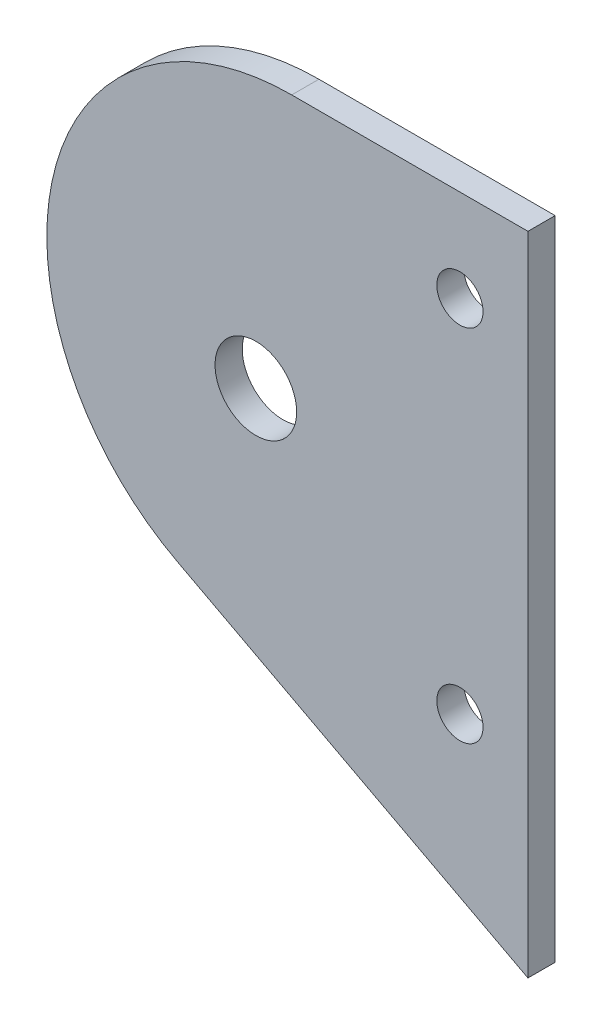
ISO-10303-21;
HEADER;
FILE_DESCRIPTION(('STEP AP214'),'2;1');
FILE_NAME('part.step','',(''),(''),'','','');
FILE_SCHEMA(('AUTOMOTIVE_DESIGN { 1 0 10303 214 1 1 1 1 }'));
ENDSEC;
DATA;
#1=APPLICATION_CONTEXT('core data for automotive mechanical design processes');
#2=APPLICATION_PROTOCOL_DEFINITION('international standard','automotive_design',2000,#1);
#3=PRODUCT_CONTEXT('',#1,'mechanical');
#4=PRODUCT('Part','Part','',(#3));
#5=PRODUCT_RELATED_PRODUCT_CATEGORY('part','',(#4));
#6=PRODUCT_DEFINITION_FORMATION('','',#4);
#7=PRODUCT_DEFINITION_CONTEXT('part definition',#1,'design');
#8=PRODUCT_DEFINITION('design','',#6,#7);
#9=PRODUCT_DEFINITION_SHAPE('','',#8);
#10=(LENGTH_UNIT() NAMED_UNIT(*) SI_UNIT(.MILLI.,.METRE.));
#11=(NAMED_UNIT(*) PLANE_ANGLE_UNIT() SI_UNIT($,.RADIAN.));
#12=(NAMED_UNIT(*) SI_UNIT($,.STERADIAN.) SOLID_ANGLE_UNIT());
#13=UNCERTAINTY_MEASURE_WITH_UNIT(LENGTH_MEASURE(1.E-05),#10,'distance_accuracy_value','');
#14=(GEOMETRIC_REPRESENTATION_CONTEXT(3) GLOBAL_UNCERTAINTY_ASSIGNED_CONTEXT((#13)) GLOBAL_UNIT_ASSIGNED_CONTEXT((#10,
#11,#12)) REPRESENTATION_CONTEXT('',''));
#15=CARTESIAN_POINT('',(0.,0.,0.));
#16=DIRECTION('',(0.,0.,1.));
#17=DIRECTION('',(1.,0.,0.));
#18=AXIS2_PLACEMENT_3D('',#15,#16,#17);
#19=CARTESIAN_POINT('',(0.,0.,2.));
#20=DIRECTION('',(0.,0.,-1.));
#21=DIRECTION('',(-1.,0.,0.));
#22=AXIS2_PLACEMENT_3D('',#19,#20,#21);
#23=PLANE('',#22);
#24=CARTESIAN_POINT('',(-160.,33.228756555323,2.));
#25=DIRECTION('',(0.,0.,-1.));
#26=DIRECTION('',(-1.,0.,0.));
#27=AXIS2_PLACEMENT_3D('',#24,#25,#26);
#28=CIRCLE('',#27,1.70000000000001);
#29=CARTESIAN_POINT('',(-161.7,33.228756555323,2.));
#30=VERTEX_POINT('',#29);
#31=EDGE_CURVE('E195',#30,#30,#28,.T.);
#32=ORIENTED_EDGE('',*,*,#31,.T.);
#33=EDGE_LOOP('',(#32));
#34=FACE_BOUND('',#33,.T.);
#35=CARTESIAN_POINT('',(-160.,6.771243444677,2.));
#36=DIRECTION('',(0.,0.,-1.));
#37=DIRECTION('',(-1.,0.,0.));
#38=AXIS2_PLACEMENT_3D('',#35,#36,#37);
#39=CIRCLE('',#38,1.70000000000001);
#40=CARTESIAN_POINT('',(-161.7,6.771243444677,2.));
#41=VERTEX_POINT('',#40);
#42=EDGE_CURVE('E83',#41,#41,#39,.T.);
#43=ORIENTED_EDGE('',*,*,#42,.T.);
#44=EDGE_LOOP('',(#43));
#45=FACE_BOUND('',#44,.T.);
#46=CARTESIAN_POINT('',(-175.,20.,2.));
#47=DIRECTION('',(0.,0.,1.));
#48=DIRECTION('',(1.,0.,0.));
#49=AXIS2_PLACEMENT_3D('',#46,#47,#48);
#50=CIRCLE('',#49,2.99999999999999);
#51=CARTESIAN_POINT('',(-172.,20.,2.));
#52=VERTEX_POINT('',#51);
#53=EDGE_CURVE('E98',#52,#52,#50,.T.);
#54=ORIENTED_EDGE('',*,*,#53,.F.);
#55=EDGE_LOOP('',(#54));
#56=FACE_BOUND('',#55,.T.);
#57=DIRECTION('',(0.,-1.,0.));
#58=VECTOR('',#57,1.);
#59=CARTESIAN_POINT('',(-155.,61.1481671859586,2.));
#60=LINE('',#59,#58);
#61=CARTESIAN_POINT('',(-155.,40.,2.));
#62=VERTEX_POINT('',#61);
#63=CARTESIAN_POINT('',(-155.,-7.53286063721654,2.));
#64=VERTEX_POINT('',#63);
#65=EDGE_CURVE('E75',#62,#64,#60,.T.);
#66=ORIENTED_EDGE('',*,*,#65,.F.);
#67=DIRECTION('',(-1.,0.,0.));
#68=VECTOR('',#67,1.);
#69=CARTESIAN_POINT('',(110.,40.,2.));
#70=LINE('',#69,#68);
#71=CARTESIAN_POINT('',(-172.363587037174,40.,2.));
#72=VERTEX_POINT('',#71);
#73=EDGE_CURVE('E80',#62,#72,#70,.T.);
#74=ORIENTED_EDGE('',*,*,#73,.T.);
#75=CARTESIAN_POINT('',(-172.363587037174,22.,2.));
#76=DIRECTION('',(0.,0.,-1.));
#77=DIRECTION('',(-1.,0.,0.));
#78=AXIS2_PLACEMENT_3D('',#75,#76,#77);
#79=CIRCLE('',#78,18.);
#80=CARTESIAN_POINT('',(-180.772782979186,6.08505659423045,2.));
#81=VERTEX_POINT('',#80);
#82=EDGE_CURVE('E57',#72,#81,#79,.F.);
#83=ORIENTED_EDGE('',*,*,#82,.T.);
#84=DIRECTION('',(0.884163522542753,-0.467177552334003,0.));
#85=VECTOR('',#84,1.);
#86=CARTESIAN_POINT('',(-244.958991581617,40.,2.));
#87=LINE('',#86,#85);
#88=EDGE_CURVE('E82',#81,#64,#87,.T.);
#89=ORIENTED_EDGE('',*,*,#88,.T.);
#90=EDGE_LOOP('',(#66,#74,#83,#89));
#91=FACE_BOUND('',#90,.T.);
#92=ADVANCED_FACE('F35',(#34,#45,#56,#91),#23,.F.);
#93=CARTESIAN_POINT('',(0.,0.,0.));
#94=DIRECTION('',(0.,0.,-1.));
#95=DIRECTION('',(-1.,0.,0.));
#96=AXIS2_PLACEMENT_3D('',#93,#94,#95);
#97=PLANE('',#96);
#98=CARTESIAN_POINT('',(-160.,33.228756555323,0.));
#99=DIRECTION('',(0.,0.,-1.));
#100=DIRECTION('',(-1.,0.,0.));
#101=AXIS2_PLACEMENT_3D('',#98,#99,#100);
#102=CIRCLE('',#101,1.69999999999998);
#103=CARTESIAN_POINT('',(-161.7,33.228756555323,0.));
#104=VERTEX_POINT('',#103);
#105=EDGE_CURVE('E198',#104,#104,#102,.T.);
#106=ORIENTED_EDGE('',*,*,#105,.F.);
#107=EDGE_LOOP('',(#106));
#108=FACE_BOUND('',#107,.T.);
#109=CARTESIAN_POINT('',(-160.,6.771243444677,0.));
#110=DIRECTION('',(0.,0.,-1.));
#111=DIRECTION('',(-1.,0.,0.));
#112=AXIS2_PLACEMENT_3D('',#109,#110,#111);
#113=CIRCLE('',#112,1.69999999999998);
#114=CARTESIAN_POINT('',(-161.7,6.771243444677,0.));
#115=VERTEX_POINT('',#114);
#116=EDGE_CURVE('E200',#115,#115,#113,.T.);
#117=ORIENTED_EDGE('',*,*,#116,.F.);
#118=EDGE_LOOP('',(#117));
#119=FACE_BOUND('',#118,.T.);
#120=CARTESIAN_POINT('',(-175.,20.,0.));
#121=DIRECTION('',(0.,0.,1.));
#122=DIRECTION('',(1.,0.,0.));
#123=AXIS2_PLACEMENT_3D('',#120,#121,#122);
#124=CIRCLE('',#123,2.99999999999999);
#125=CARTESIAN_POINT('',(-172.,20.,0.));
#126=VERTEX_POINT('',#125);
#127=EDGE_CURVE('E112',#126,#126,#124,.T.);
#128=ORIENTED_EDGE('',*,*,#127,.T.);
#129=EDGE_LOOP('',(#128));
#130=FACE_BOUND('',#129,.T.);
#131=DIRECTION('',(-1.,0.,0.));
#132=VECTOR('',#131,1.);
#133=CARTESIAN_POINT('',(-244.958991581617,40.,0.));
#134=LINE('',#133,#132);
#135=CARTESIAN_POINT('',(-155.,40.,0.));
#136=VERTEX_POINT('',#135);
#137=CARTESIAN_POINT('',(-172.363587037174,40.,0.));
#138=VERTEX_POINT('',#137);
#139=EDGE_CURVE('E91',#136,#138,#134,.T.);
#140=ORIENTED_EDGE('',*,*,#139,.F.);
#141=DIRECTION('',(0.,-1.,0.));
#142=VECTOR('',#141,1.);
#143=CARTESIAN_POINT('',(-155.,0.,0.));
#144=LINE('',#143,#142);
#145=CARTESIAN_POINT('',(-155.,-7.53286063721655,0.));
#146=VERTEX_POINT('',#145);
#147=EDGE_CURVE('E49',#136,#146,#144,.T.);
#148=ORIENTED_EDGE('',*,*,#147,.T.);
#149=DIRECTION('',(0.884163522542753,-0.467177552334003,0.));
#150=VECTOR('',#149,1.);
#151=CARTESIAN_POINT('',(-244.958991581617,40.,0.));
#152=LINE('',#151,#150);
#153=CARTESIAN_POINT('',(-180.772782979186,6.08505659423045,0.));
#154=VERTEX_POINT('',#153);
#155=EDGE_CURVE('E95',#154,#146,#152,.T.);
#156=ORIENTED_EDGE('',*,*,#155,.F.);
#157=CARTESIAN_POINT('',(-172.363587037174,22.,0.));
#158=DIRECTION('',(0.,0.,-1.));
#159=DIRECTION('',(-1.,0.,0.));
#160=AXIS2_PLACEMENT_3D('',#157,#158,#159);
#161=CIRCLE('',#160,18.);
#162=EDGE_CURVE('E89',#154,#138,#161,.T.);
#163=ORIENTED_EDGE('',*,*,#162,.T.);
#164=EDGE_LOOP('',(#140,#148,#156,#163));
#165=FACE_BOUND('',#164,.T.);
#166=ADVANCED_FACE('F109',(#108,#119,#130,#165),#97,.T.);
#167=CARTESIAN_POINT('',(-244.958991581617,40.,2.));
#168=DIRECTION('',(0.467177552334003,0.884163522542753,0.));
#169=DIRECTION('',(-0.884163522542753,0.467177552334003,0.));
#170=AXIS2_PLACEMENT_3D('',#167,#168,#169);
#171=PLANE('',#170);
#172=DIRECTION('',(0.,0.,-1.));
#173=VECTOR('',#172,1.);
#174=CARTESIAN_POINT('',(-155.,-7.53286063721654,2.));
#175=LINE('',#174,#173);
#176=EDGE_CURVE('E110',#64,#146,#175,.T.);
#177=ORIENTED_EDGE('',*,*,#176,.F.);
#178=ORIENTED_EDGE('',*,*,#88,.F.);
#179=DIRECTION('',(0.,0.,-1.));
#180=VECTOR('',#179,1.);
#181=CARTESIAN_POINT('',(-180.772782979186,6.08505659423045,2.));
#182=LINE('',#181,#180);
#183=EDGE_CURVE('E43',#81,#154,#182,.T.);
#184=ORIENTED_EDGE('',*,*,#183,.T.);
#185=ORIENTED_EDGE('',*,*,#155,.T.);
#186=EDGE_LOOP('',(#177,#178,#184,#185));
#187=FACE_BOUND('',#186,.T.);
#188=ADVANCED_FACE('F106',(#187),#171,.F.);
#189=CARTESIAN_POINT('',(-244.958991581617,40.,2.));
#190=DIRECTION('',(0.,-1.,0.));
#191=DIRECTION('',(0.,0.,-1.));
#192=AXIS2_PLACEMENT_3D('',#189,#190,#191);
#193=PLANE('',#192);
#194=DIRECTION('',(0.,0.,1.));
#195=VECTOR('',#194,1.);
#196=CARTESIAN_POINT('',(-155.,40.,2.));
#197=LINE('',#196,#195);
#198=EDGE_CURVE('E11',#136,#62,#197,.T.);
#199=ORIENTED_EDGE('',*,*,#198,.F.);
#200=ORIENTED_EDGE('',*,*,#139,.T.);
#201=DIRECTION('',(0.,0.,-1.));
#202=VECTOR('',#201,1.);
#203=CARTESIAN_POINT('',(-172.363587037174,40.,2.));
#204=LINE('',#203,#202);
#205=EDGE_CURVE('E87',#138,#72,#204,.F.);
#206=ORIENTED_EDGE('',*,*,#205,.T.);
#207=ORIENTED_EDGE('',*,*,#73,.F.);
#208=EDGE_LOOP('',(#199,#200,#206,#207));
#209=FACE_BOUND('',#208,.T.);
#210=ADVANCED_FACE('F85',(#209),#193,.F.);
#211=CARTESIAN_POINT('',(-175.,20.,2.));
#212=DIRECTION('',(0.,0.,-1.));
#213=DIRECTION('',(-1.,0.,0.));
#214=AXIS2_PLACEMENT_3D('',#211,#212,#213);
#215=CYLINDRICAL_SURFACE('',#214,2.99999999999999);
#216=ORIENTED_EDGE('',*,*,#53,.T.);
#217=EDGE_LOOP('',(#216));
#218=FACE_BOUND('',#217,.T.);
#219=ORIENTED_EDGE('',*,*,#127,.F.);
#220=EDGE_LOOP('',(#219));
#221=FACE_BOUND('',#220,.T.);
#222=ADVANCED_FACE('F121',(#218,#221),#215,.F.);
#223=CARTESIAN_POINT('',(-172.363587037174,22.,2.));
#224=DIRECTION('',(0.,0.,-1.));
#225=DIRECTION('',(-1.,0.,0.));
#226=AXIS2_PLACEMENT_3D('',#223,#224,#225);
#227=CYLINDRICAL_SURFACE('',#226,18.);
#228=ORIENTED_EDGE('',*,*,#82,.F.);
#229=ORIENTED_EDGE('',*,*,#205,.F.);
#230=ORIENTED_EDGE('',*,*,#162,.F.);
#231=ORIENTED_EDGE('',*,*,#183,.F.);
#232=EDGE_LOOP('',(#228,#229,#230,#231));
#233=FACE_BOUND('',#232,.T.);
#234=ADVANCED_FACE('F37',(#233),#227,.T.);
#235=CARTESIAN_POINT('',(-155.,61.1481671859586,2.));
#236=DIRECTION('',(1.,0.,0.));
#237=DIRECTION('',(0.,1.,0.));
#238=AXIS2_PLACEMENT_3D('',#235,#236,#237);
#239=PLANE('',#238);
#240=ORIENTED_EDGE('',*,*,#176,.T.);
#241=ORIENTED_EDGE('',*,*,#147,.F.);
#242=ORIENTED_EDGE('',*,*,#198,.T.);
#243=ORIENTED_EDGE('',*,*,#65,.T.);
#244=EDGE_LOOP('',(#240,#241,#242,#243));
#245=FACE_BOUND('',#244,.T.);
#246=ADVANCED_FACE('F74',(#245),#239,.T.);
#247=CARTESIAN_POINT('',(-160.,6.771243444677,0.));
#248=DIRECTION('',(0.,0.,-1.));
#249=DIRECTION('',(-1.,0.,0.));
#250=AXIS2_PLACEMENT_3D('',#247,#248,#249);
#251=CYLINDRICAL_SURFACE('',#250,1.69999999999999);
#252=ORIENTED_EDGE('',*,*,#42,.F.);
#253=EDGE_LOOP('',(#252));
#254=FACE_BOUND('',#253,.T.);
#255=ORIENTED_EDGE('',*,*,#116,.T.);
#256=EDGE_LOOP('',(#255));
#257=FACE_BOUND('',#256,.T.);
#258=ADVANCED_FACE('F161',(#254,#257),#251,.F.);
#259=CARTESIAN_POINT('',(-160.,33.228756555323,0.));
#260=DIRECTION('',(0.,0.,-1.));
#261=DIRECTION('',(-1.,0.,0.));
#262=AXIS2_PLACEMENT_3D('',#259,#260,#261);
#263=CYLINDRICAL_SURFACE('',#262,1.69999999999999);
#264=ORIENTED_EDGE('',*,*,#31,.F.);
#265=EDGE_LOOP('',(#264));
#266=FACE_BOUND('',#265,.T.);
#267=ORIENTED_EDGE('',*,*,#105,.T.);
#268=EDGE_LOOP('',(#267));
#269=FACE_BOUND('',#268,.T.);
#270=ADVANCED_FACE('F179',(#266,#269),#263,.F.);
#271=CLOSED_SHELL('',(#92,#166,#188,#210,#222,#234,#246,#258,#270));
#272=MANIFOLD_SOLID_BREP('B2',#271);
#273=ADVANCED_BREP_SHAPE_REPRESENTATION('',(#18,#272),#14);
#274=SHAPE_DEFINITION_REPRESENTATION(#9,#273);
ENDSEC;
END-ISO-10303-21;
